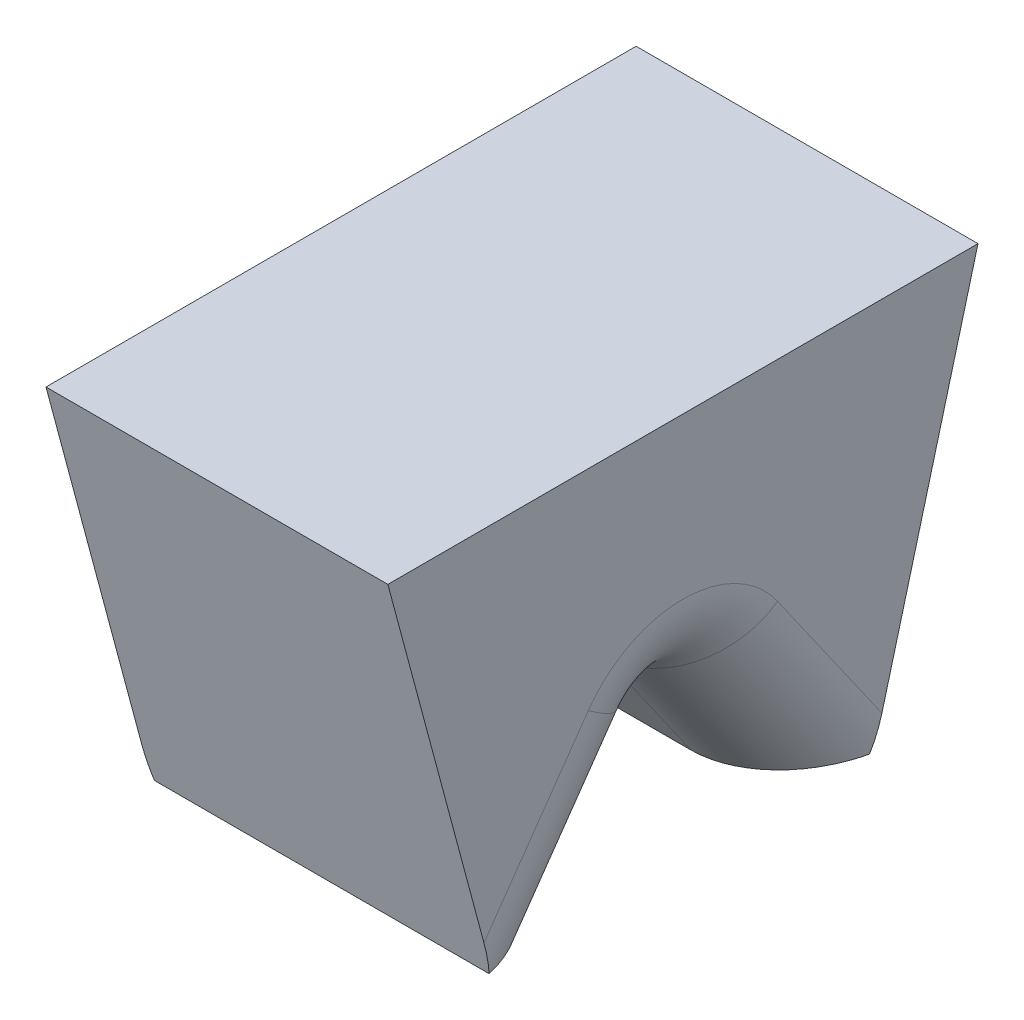
ISO-10303-21;
HEADER;
FILE_DESCRIPTION(('STEP AP214'),'2;1');
FILE_NAME('part.step','',(''),(''),'','','');
FILE_SCHEMA(('AUTOMOTIVE_DESIGN { 1 0 10303 214 1 1 1 1 }'));
ENDSEC;
DATA;
#1=APPLICATION_CONTEXT('core data for automotive mechanical design processes');
#2=APPLICATION_PROTOCOL_DEFINITION('international standard','automotive_design',2000,#1);
#3=PRODUCT_CONTEXT('',#1,'mechanical');
#4=PRODUCT('Part','Part','',(#3));
#5=PRODUCT_RELATED_PRODUCT_CATEGORY('part','',(#4));
#6=PRODUCT_DEFINITION_FORMATION('','',#4);
#7=PRODUCT_DEFINITION_CONTEXT('part definition',#1,'design');
#8=PRODUCT_DEFINITION('design','',#6,#7);
#9=PRODUCT_DEFINITION_SHAPE('','',#8);
#10=(LENGTH_UNIT() NAMED_UNIT(*) SI_UNIT(.MILLI.,.METRE.));
#11=(NAMED_UNIT(*) PLANE_ANGLE_UNIT() SI_UNIT($,.RADIAN.));
#12=(NAMED_UNIT(*) SI_UNIT($,.STERADIAN.) SOLID_ANGLE_UNIT());
#13=UNCERTAINTY_MEASURE_WITH_UNIT(LENGTH_MEASURE(1.E-05),#10,'distance_accuracy_value','');
#14=(GEOMETRIC_REPRESENTATION_CONTEXT(3) GLOBAL_UNCERTAINTY_ASSIGNED_CONTEXT((#13)) GLOBAL_UNIT_ASSIGNED_CONTEXT((#10,
#11,#12)) REPRESENTATION_CONTEXT('',''));
#15=CARTESIAN_POINT('',(0.,0.,0.));
#16=DIRECTION('',(0.,0.,1.));
#17=DIRECTION('',(1.,0.,0.));
#18=AXIS2_PLACEMENT_3D('',#15,#16,#17);
#19=CARTESIAN_POINT('',(0.,0.20650406504065,0.));
#20=DIRECTION('',(0.,1.,0.));
#21=DIRECTION('',(0.,0.,1.));
#22=AXIS2_PLACEMENT_3D('',#19,#20,#21);
#23=PLANE('',#22);
#24=DIRECTION('',(0.,0.,-1.));
#25=VECTOR('',#24,1.);
#26=CARTESIAN_POINT('',(-0.0914400000000001,0.20650406504065,1.50859998));
#27=LINE('',#26,#25);
#28=CARTESIAN_POINT('',(-0.0914399999999997,0.20650406504065,0.155662597461386));
#29=VERTEX_POINT('',#28);
#30=CARTESIAN_POINT('',(-0.0914399999999997,0.20650406504065,-0.155662597461386));
#31=VERTEX_POINT('',#30);
#32=EDGE_CURVE('E142',#29,#31,#27,.T.);
#33=ORIENTED_EDGE('',*,*,#32,.F.);
#34=DIRECTION('',(-1.,0.,0.));
#35=VECTOR('',#34,1.);
#36=CARTESIAN_POINT('',(1.50859998,0.20650406504065,0.155662597461386));
#37=LINE('',#36,#35);
#38=CARTESIAN_POINT('',(0.0888999999999999,0.20650406504065,0.155662597461386));
#39=VERTEX_POINT('',#38);
#40=EDGE_CURVE('E57',#39,#29,#37,.T.);
#41=ORIENTED_EDGE('',*,*,#40,.F.);
#42=DIRECTION('',(0.,0.,1.));
#43=VECTOR('',#42,1.);
#44=CARTESIAN_POINT('',(0.0888999999999999,0.20650406504065,1.50859998));
#45=LINE('',#44,#43);
#46=CARTESIAN_POINT('',(0.0888999999999999,0.20650406504065,-0.155662597461386));
#47=VERTEX_POINT('',#46);
#48=EDGE_CURVE('E12',#47,#39,#45,.T.);
#49=ORIENTED_EDGE('',*,*,#48,.F.);
#50=DIRECTION('',(1.,0.,0.));
#51=VECTOR('',#50,1.);
#52=CARTESIAN_POINT('',(1.50859998,0.20650406504065,-0.155662597461386));
#53=LINE('',#52,#51);
#54=EDGE_CURVE('E129',#31,#47,#53,.T.);
#55=ORIENTED_EDGE('',*,*,#54,.F.);
#56=EDGE_LOOP('',(#33,#41,#49,#55));
#57=FACE_BOUND('',#56,.T.);
#58=ADVANCED_FACE('F42',(#57),#23,.T.);
#59=CARTESIAN_POINT('',(1.50859998,0.,-0.10033));
#60=DIRECTION('',(0.,-0.258819045102522,-0.965925826289068));
#61=DIRECTION('',(0.,0.965925826289068,-0.258819045102522));
#62=AXIS2_PLACEMENT_3D('',#59,#60,#61);
#63=PLANE('',#62);
#64=DIRECTION('',(0.,0.965925826289068,-0.258819045102522));
#65=VECTOR('',#64,1.);
#66=CARTESIAN_POINT('',(-0.0914400000000001,0.,-0.10033));
#67=LINE('',#66,#65);
#68=CARTESIAN_POINT('',(-0.0914400000000001,0.0173247470469576,-0.104972151980306));
#69=VERTEX_POINT('',#68);
#70=EDGE_CURVE('E141',#69,#31,#67,.T.);
#71=ORIENTED_EDGE('',*,*,#70,.T.);
#72=ORIENTED_EDGE('',*,*,#54,.T.);
#73=DIRECTION('',(0.,-0.965925826289068,0.258819045102522));
#74=VECTOR('',#73,1.);
#75=CARTESIAN_POINT('',(0.0888999999999998,0.,-0.10033));
#76=LINE('',#75,#74);
#77=CARTESIAN_POINT('',(0.0888999999999998,0.0173247470469576,-0.104972151980306));
#78=VERTEX_POINT('',#77);
#79=EDGE_CURVE('E138',#47,#78,#76,.T.);
#80=ORIENTED_EDGE('',*,*,#79,.T.);
#81=CARTESIAN_POINT('',(0.0380999999999999,0.0173247470469576,-0.104972151980306));
#82=DIRECTION('',(0.,-0.258819045102522,-0.965925826289068));
#83=DIRECTION('',(0.,-0.965925826289068,0.258819045102522));
#84=AXIS2_PLACEMENT_3D('',#81,#82,#83);
#85=ELLIPSE('',#84,0.0663146902980799,0.0508);
#86=CARTESIAN_POINT('',(0.0870066537651457,0.,-0.10033));
#87=VERTEX_POINT('',#86);
#88=EDGE_CURVE('E205',#78,#87,#85,.T.);
#89=ORIENTED_EDGE('',*,*,#88,.T.);
#90=DIRECTION('',(-1.,0.,0.));
#91=VECTOR('',#90,1.);
#92=CARTESIAN_POINT('',(1.50859998,0.,-0.10033));
#93=LINE('',#92,#91);
#94=CARTESIAN_POINT('',(-0.0895466537651458,0.,-0.10033));
#95=VERTEX_POINT('',#94);
#96=EDGE_CURVE('E157',#87,#95,#93,.T.);
#97=ORIENTED_EDGE('',*,*,#96,.T.);
#98=CARTESIAN_POINT('',(-0.04064,0.0173247470469576,-0.104972151980306));
#99=DIRECTION('',(0.,-0.258819045102522,-0.965925826289068));
#100=DIRECTION('',(0.,0.965925826289068,-0.258819045102522));
#101=AXIS2_PLACEMENT_3D('',#98,#99,#100);
#102=ELLIPSE('',#101,0.0663146902980799,0.0508);
#103=EDGE_CURVE('E188',#95,#69,#102,.T.);
#104=ORIENTED_EDGE('',*,*,#103,.T.);
#105=EDGE_LOOP('',(#71,#72,#80,#89,#97,#104));
#106=FACE_BOUND('',#105,.T.);
#107=ADVANCED_FACE('F137',(#106),#63,.T.);
#108=CARTESIAN_POINT('',(1.50859998,0.,0.10033));
#109=DIRECTION('',(0.,-0.258819045102522,0.965925826289068));
#110=DIRECTION('',(0.,-0.965925826289068,-0.258819045102522));
#111=AXIS2_PLACEMENT_3D('',#108,#109,#110);
#112=PLANE('',#111);
#113=DIRECTION('',(0.,0.965925826289068,0.258819045102522));
#114=VECTOR('',#113,1.);
#115=CARTESIAN_POINT('',(0.0888999999999998,0.,0.10033));
#116=LINE('',#115,#114);
#117=CARTESIAN_POINT('',(0.0888999999999998,0.0173247470469576,0.104972151980306));
#118=VERTEX_POINT('',#117);
#119=EDGE_CURVE('E148',#118,#39,#116,.T.);
#120=ORIENTED_EDGE('',*,*,#119,.T.);
#121=ORIENTED_EDGE('',*,*,#40,.T.);
#122=DIRECTION('',(0.,-0.965925826289068,-0.258819045102522));
#123=VECTOR('',#122,1.);
#124=CARTESIAN_POINT('',(-0.0914400000000001,0.,0.10033));
#125=LINE('',#124,#123);
#126=CARTESIAN_POINT('',(-0.0914400000000001,0.0173247470469576,0.104972151980306));
#127=VERTEX_POINT('',#126);
#128=EDGE_CURVE('E159',#29,#127,#125,.T.);
#129=ORIENTED_EDGE('',*,*,#128,.T.);
#130=CARTESIAN_POINT('',(-0.04064,0.0173247470469576,0.104972151980306));
#131=DIRECTION('',(0.,-0.258819045102522,0.965925826289068));
#132=DIRECTION('',(0.,-0.965925826289068,-0.258819045102522));
#133=AXIS2_PLACEMENT_3D('',#130,#131,#132);
#134=ELLIPSE('',#133,0.0663146902980799,0.0508);
#135=CARTESIAN_POINT('',(-0.0895466537651458,0.,0.10033));
#136=VERTEX_POINT('',#135);
#137=EDGE_CURVE('E175',#127,#136,#134,.T.);
#138=ORIENTED_EDGE('',*,*,#137,.T.);
#139=DIRECTION('',(-1.,0.,0.));
#140=VECTOR('',#139,1.);
#141=CARTESIAN_POINT('',(1.50859998,0.,0.10033));
#142=LINE('',#141,#140);
#143=CARTESIAN_POINT('',(0.0870066537651457,0.,0.10033));
#144=VERTEX_POINT('',#143);
#145=EDGE_CURVE('E150',#144,#136,#142,.T.);
#146=ORIENTED_EDGE('',*,*,#145,.F.);
#147=CARTESIAN_POINT('',(0.0380999999999999,0.0173247470469576,0.104972151980306));
#148=DIRECTION('',(0.,-0.258819045102522,0.965925826289068));
#149=DIRECTION('',(0.,0.965925826289068,0.258819045102522));
#150=AXIS2_PLACEMENT_3D('',#147,#148,#149);
#151=ELLIPSE('',#150,0.0663146902980799,0.0508);
#152=EDGE_CURVE('E212',#144,#118,#151,.T.);
#153=ORIENTED_EDGE('',*,*,#152,.T.);
#154=EDGE_LOOP('',(#120,#121,#129,#138,#146,#153));
#155=FACE_BOUND('',#154,.T.);
#156=ADVANCED_FACE('F250',(#155),#112,.T.);
#157=CARTESIAN_POINT('',(-0.0914400000000001,0.39640002,1.50859998));
#158=DIRECTION('',(-1.,0.,0.));
#159=DIRECTION('',(0.,-1.,0.));
#160=AXIS2_PLACEMENT_3D('',#157,#158,#159);
#161=PLANE('',#160);
#162=ORIENTED_EDGE('',*,*,#128,.F.);
#163=ORIENTED_EDGE('',*,*,#32,.T.);
#164=ORIENTED_EDGE('',*,*,#70,.F.);
#165=DIRECTION('',(0.,-0.819152044288994,-0.573576436351043));
#166=VECTOR('',#165,1.);
#167=CARTESIAN_POINT('',(-0.09144,0.0959252195599596,-0.0499355086198571));
#168=LINE('',#167,#166);
#169=CARTESIAN_POINT('',(-0.09144,0.0959252195599598,-0.049935508619857));
#170=VERTEX_POINT('',#169);
#171=EDGE_CURVE('E168',#69,#170,#168,.F.);
#172=ORIENTED_EDGE('',*,*,#171,.T.);
#173=CARTESIAN_POINT('',(-0.09144,0.0609599999999999,0.));
#174=DIRECTION('',(-1.,0.,0.));
#175=DIRECTION('',(0.,-1.,0.));
#176=AXIS2_PLACEMENT_3D('',#173,#174,#175);
#177=CIRCLE('',#176,0.0609600000000001);
#178=CARTESIAN_POINT('',(-0.09144,0.0959252195599596,0.0499355086198571));
#179=VERTEX_POINT('',#178);
#180=EDGE_CURVE('E170',#170,#179,#177,.F.);
#181=ORIENTED_EDGE('',*,*,#180,.T.);
#182=DIRECTION('',(0.,0.819152044288994,-0.573576436351043));
#183=VECTOR('',#182,1.);
#184=CARTESIAN_POINT('',(-0.09144,0.029137682966633,0.0967006452009609));
#185=LINE('',#184,#183);
#186=EDGE_CURVE('E172',#179,#127,#185,.F.);
#187=ORIENTED_EDGE('',*,*,#186,.T.);
#188=EDGE_LOOP('',(#162,#163,#164,#172,#181,#187));
#189=FACE_BOUND('',#188,.T.);
#190=ADVANCED_FACE('F252',(#189),#161,.T.);
#191=CARTESIAN_POINT('',(0.0888999999999999,-0.00999998,1.50859998));
#192=DIRECTION('',(1.,0.,0.));
#193=DIRECTION('',(0.,1.,0.));
#194=AXIS2_PLACEMENT_3D('',#191,#192,#193);
#195=PLANE('',#194);
#196=ORIENTED_EDGE('',*,*,#79,.F.);
#197=ORIENTED_EDGE('',*,*,#48,.T.);
#198=ORIENTED_EDGE('',*,*,#119,.F.);
#199=DIRECTION('',(0.,-0.819152044288994,0.573576436351043));
#200=VECTOR('',#199,1.);
#201=CARTESIAN_POINT('',(0.0888999999999999,0.0959252195599596,0.0499355086198571));
#202=LINE('',#201,#200);
#203=CARTESIAN_POINT('',(0.0888999999999999,0.0959252195599596,0.0499355086198571));
#204=VERTEX_POINT('',#203);
#205=EDGE_CURVE('E202',#118,#204,#202,.F.);
#206=ORIENTED_EDGE('',*,*,#205,.T.);
#207=CARTESIAN_POINT('',(0.0888999999999999,0.0609599999999999,0.));
#208=DIRECTION('',(1.,0.,0.));
#209=DIRECTION('',(0.,1.,0.));
#210=AXIS2_PLACEMENT_3D('',#207,#208,#209);
#211=CIRCLE('',#210,0.0609600000000001);
#212=CARTESIAN_POINT('',(0.0888999999999999,0.0959252195599596,-0.0499355086198571));
#213=VERTEX_POINT('',#212);
#214=EDGE_CURVE('E200',#204,#213,#211,.F.);
#215=ORIENTED_EDGE('',*,*,#214,.T.);
#216=DIRECTION('',(0.,0.819152044288994,0.573576436351043));
#217=VECTOR('',#216,1.);
#218=CARTESIAN_POINT('',(0.0888999999999999,0.029137682966633,-0.0967006452009609));
#219=LINE('',#218,#217);
#220=EDGE_CURVE('E146',#213,#78,#219,.F.);
#221=ORIENTED_EDGE('',*,*,#220,.T.);
#222=EDGE_LOOP('',(#196,#197,#198,#206,#215,#221));
#223=FACE_BOUND('',#222,.T.);
#224=ADVANCED_FACE('F144',(#223),#195,.T.);
#225=CARTESIAN_POINT('',(0.,0.,0.));
#226=DIRECTION('',(0.,1.,0.));
#227=DIRECTION('',(0.,0.,1.));
#228=AXIS2_PLACEMENT_3D('',#225,#226,#227);
#229=PLANE('',#228);
#230=ORIENTED_EDGE('',*,*,#96,.F.);
#231=CARTESIAN_POINT('',(0.0380999999999999,0.,-0.117103070460162));
#232=DIRECTION('',(0.,1.,0.));
#233=DIRECTION('',(0.,0.,-1.));
#234=AXIS2_PLACEMENT_3D('',#231,#232,#233);
#235=ELLIPSE('',#234,0.0620153491090818,0.0508);
#236=CARTESIAN_POINT('',(0.0380999999999999,0.,-0.05508772135108));
#237=VERTEX_POINT('',#236);
#238=EDGE_CURVE('E207',#87,#237,#235,.F.);
#239=ORIENTED_EDGE('',*,*,#238,.T.);
#240=DIRECTION('',(-1.,0.,0.));
#241=VECTOR('',#240,1.);
#242=CARTESIAN_POINT('',(0.,0.,-0.05508772135108));
#243=LINE('',#242,#241);
#244=CARTESIAN_POINT('',(-0.04064,0.,-0.05508772135108));
#245=VERTEX_POINT('',#244);
#246=EDGE_CURVE('E163',#237,#245,#243,.T.);
#247=ORIENTED_EDGE('',*,*,#246,.T.);
#248=CARTESIAN_POINT('',(-0.04064,0.,-0.117103070460162));
#249=DIRECTION('',(0.,1.,0.));
#250=DIRECTION('',(0.,0.,1.));
#251=AXIS2_PLACEMENT_3D('',#248,#249,#250);
#252=ELLIPSE('',#251,0.0620153491090818,0.0508);
#253=EDGE_CURVE('E185',#245,#95,#252,.F.);
#254=ORIENTED_EDGE('',*,*,#253,.T.);
#255=EDGE_LOOP('',(#230,#239,#247,#254));
#256=FACE_BOUND('',#255,.T.);
#257=ADVANCED_FACE('F272',(#256),#229,.F.);
#258=DIRECTION('',(1.,0.,0.));
#259=VECTOR('',#258,1.);
#260=CARTESIAN_POINT('',(0.,0.,0.05508772135108));
#261=LINE('',#260,#259);
#262=CARTESIAN_POINT('',(-0.04064,0.,0.05508772135108));
#263=VERTEX_POINT('',#262);
#264=CARTESIAN_POINT('',(0.0380999999999999,0.,0.05508772135108));
#265=VERTEX_POINT('',#264);
#266=EDGE_CURVE('E161',#263,#265,#261,.T.);
#267=ORIENTED_EDGE('',*,*,#266,.T.);
#268=CARTESIAN_POINT('',(0.0380999999999999,0.,0.117103070460162));
#269=DIRECTION('',(0.,1.,0.));
#270=DIRECTION('',(0.,0.,-1.));
#271=AXIS2_PLACEMENT_3D('',#268,#269,#270);
#272=ELLIPSE('',#271,0.0620153491090818,0.0508);
#273=EDGE_CURVE('E64',#265,#144,#272,.F.);
#274=ORIENTED_EDGE('',*,*,#273,.T.);
#275=ORIENTED_EDGE('',*,*,#145,.T.);
#276=CARTESIAN_POINT('',(-0.04064,0.,0.117103070460162));
#277=DIRECTION('',(0.,1.,0.));
#278=DIRECTION('',(0.,0.,1.));
#279=AXIS2_PLACEMENT_3D('',#276,#277,#278);
#280=ELLIPSE('',#279,0.0620153491090818,0.0508);
#281=EDGE_CURVE('E178',#136,#263,#280,.F.);
#282=ORIENTED_EDGE('',*,*,#281,.T.);
#283=EDGE_LOOP('',(#267,#274,#275,#282));
#284=FACE_BOUND('',#283,.T.);
#285=ADVANCED_FACE('F233',(#284),#229,.F.);
#286=CARTESIAN_POINT('',(-1.20142,0.0667875365933266,-0.00832258476997621));
#287=DIRECTION('',(0.,0.573576436351043,-0.819152044288994));
#288=DIRECTION('',(0.,0.819152044288994,0.573576436351043));
#289=AXIS2_PLACEMENT_3D('',#286,#287,#288);
#290=PLANE('',#289);
#291=ORIENTED_EDGE('',*,*,#246,.F.);
#292=DIRECTION('',(0.,0.819152044288994,0.573576436351043));
#293=VECTOR('',#292,1.);
#294=CARTESIAN_POINT('',(0.0380999999999999,0.0667875365933266,-0.00832258476997621));
#295=LINE('',#294,#293);
#296=CARTESIAN_POINT('',(0.0380999999999999,0.0667875365933266,-0.00832258476997621));
#297=VERTEX_POINT('',#296);
#298=EDGE_CURVE('E190',#237,#297,#295,.T.);
#299=ORIENTED_EDGE('',*,*,#298,.T.);
#300=DIRECTION('',(1.,0.,0.));
#301=VECTOR('',#300,1.);
#302=CARTESIAN_POINT('',(-1.20142,0.0667875365933266,-0.00832258476997621));
#303=LINE('',#302,#301);
#304=CARTESIAN_POINT('',(-0.04064,0.0667875365933266,-0.00832258476997621));
#305=VERTEX_POINT('',#304);
#306=EDGE_CURVE('E197',#305,#297,#303,.T.);
#307=ORIENTED_EDGE('',*,*,#306,.F.);
#308=DIRECTION('',(0.,-0.819152044288994,-0.573576436351043));
#309=VECTOR('',#308,1.);
#310=CARTESIAN_POINT('',(-0.04064,0.,-0.05508772135108));
#311=LINE('',#310,#309);
#312=EDGE_CURVE('E182',#305,#245,#311,.T.);
#313=ORIENTED_EDGE('',*,*,#312,.T.);
#314=EDGE_LOOP('',(#291,#299,#307,#313));
#315=FACE_BOUND('',#314,.T.);
#316=ADVANCED_FACE('F265',(#315),#290,.F.);
#317=CARTESIAN_POINT('',(-1.20142,0.0609599999999999,0.));
#318=DIRECTION('',(1.,0.,0.));
#319=DIRECTION('',(0.,0.,-1.));
#320=AXIS2_PLACEMENT_3D('',#317,#318,#319);
#321=CYLINDRICAL_SURFACE('',#320,0.0101600000000001);
#322=ORIENTED_EDGE('',*,*,#306,.T.);
#323=CARTESIAN_POINT('',(0.0380999999999999,0.0609599999999999,0.));
#324=DIRECTION('',(1.,0.,0.));
#325=DIRECTION('',(0.,1.,0.));
#326=AXIS2_PLACEMENT_3D('',#323,#324,#325);
#327=CIRCLE('',#326,0.0101600000000001);
#328=CARTESIAN_POINT('',(0.0380999999999999,0.0667875365933266,0.00832258476997621));
#329=VERTEX_POINT('',#328);
#330=EDGE_CURVE('E50',#297,#329,#327,.T.);
#331=ORIENTED_EDGE('',*,*,#330,.T.);
#332=DIRECTION('',(1.,0.,0.));
#333=VECTOR('',#332,1.);
#334=CARTESIAN_POINT('',(-1.20142,0.0667875365933266,0.00832258476997621));
#335=LINE('',#334,#333);
#336=CARTESIAN_POINT('',(-0.04064,0.0667875365933266,0.00832258476997621));
#337=VERTEX_POINT('',#336);
#338=EDGE_CURVE('E152',#337,#329,#335,.T.);
#339=ORIENTED_EDGE('',*,*,#338,.F.);
#340=CARTESIAN_POINT('',(-0.04064,0.0609599999999999,0.));
#341=DIRECTION('',(-1.,0.,0.));
#342=DIRECTION('',(0.,-1.,0.));
#343=AXIS2_PLACEMENT_3D('',#340,#341,#342);
#344=CIRCLE('',#343,0.0101600000000001);
#345=EDGE_CURVE('E180',#337,#305,#344,.T.);
#346=ORIENTED_EDGE('',*,*,#345,.T.);
#347=EDGE_LOOP('',(#322,#331,#339,#346));
#348=FACE_BOUND('',#347,.T.);
#349=ADVANCED_FACE('F243',(#348),#321,.F.);
#350=CARTESIAN_POINT('',(-1.20142,-0.00999998000000012,0.0620897827290263));
#351=DIRECTION('',(0.,0.573576436351043,0.819152044288994));
#352=DIRECTION('',(0.,-0.819152044288994,0.573576436351043));
#353=AXIS2_PLACEMENT_3D('',#350,#351,#352);
#354=PLANE('',#353);
#355=ORIENTED_EDGE('',*,*,#338,.T.);
#356=DIRECTION('',(0.,-0.819152044288994,0.573576436351043));
#357=VECTOR('',#356,1.);
#358=CARTESIAN_POINT('',(0.0380999999999999,0.,0.05508772135108));
#359=LINE('',#358,#357);
#360=EDGE_CURVE('E209',#329,#265,#359,.T.);
#361=ORIENTED_EDGE('',*,*,#360,.T.);
#362=ORIENTED_EDGE('',*,*,#266,.F.);
#363=DIRECTION('',(0.,0.819152044288994,-0.573576436351043));
#364=VECTOR('',#363,1.);
#365=CARTESIAN_POINT('',(-0.04064,0.0667875365933266,0.0083225847699762));
#366=LINE('',#365,#364);
#367=EDGE_CURVE('E165',#263,#337,#366,.T.);
#368=ORIENTED_EDGE('',*,*,#367,.T.);
#369=EDGE_LOOP('',(#355,#361,#362,#368));
#370=FACE_BOUND('',#369,.T.);
#371=ADVANCED_FACE('F230',(#370),#354,.F.);
#372=CARTESIAN_POINT('',(-0.04064,0.0959252195599597,-0.049935508619857));
#373=DIRECTION('',(0.,0.819152044288994,0.573576436351043));
#374=DIRECTION('',(0.,-0.573576436351043,0.819152044288994));
#375=AXIS2_PLACEMENT_3D('',#372,#373,#374);
#376=CYLINDRICAL_SURFACE('',#375,0.0508);
#377=ORIENTED_EDGE('',*,*,#253,.F.);
#378=ORIENTED_EDGE('',*,*,#312,.F.);
#379=CARTESIAN_POINT('',(-0.04064,0.0959252195599598,-0.049935508619857));
#380=DIRECTION('',(0.,0.819152044288991,0.573576436351046));
#381=DIRECTION('',(0.,-0.573576436351046,0.819152044288992));
#382=AXIS2_PLACEMENT_3D('',#379,#380,#381);
#383=CIRCLE('',#382,0.0508);
#384=EDGE_CURVE('E193',#170,#305,#383,.T.);
#385=ORIENTED_EDGE('',*,*,#384,.F.);
#386=ORIENTED_EDGE('',*,*,#171,.F.);
#387=ORIENTED_EDGE('',*,*,#103,.F.);
#388=EDGE_LOOP('',(#377,#378,#385,#386,#387));
#389=FACE_BOUND('',#388,.T.);
#390=ADVANCED_FACE('F261',(#389),#376,.T.);
#391=CARTESIAN_POINT('',(-0.04064,0.0609599999999999,0.));
#392=DIRECTION('',(-1.,0.,0.));
#393=DIRECTION('',(0.,-1.,0.));
#394=AXIS2_PLACEMENT_3D('',#391,#392,#393);
#395=TOROIDAL_SURFACE('',#394,0.0609600000000001,0.0508);
#396=ORIENTED_EDGE('',*,*,#384,.T.);
#397=ORIENTED_EDGE('',*,*,#345,.F.);
#398=CARTESIAN_POINT('',(-0.04064,0.0959252195599596,0.0499355086198571));
#399=DIRECTION('',(0.,-0.819152044288994,0.573576436351043));
#400=DIRECTION('',(0.,-0.573576436351043,-0.819152044288994));
#401=AXIS2_PLACEMENT_3D('',#398,#399,#400);
#402=CIRCLE('',#401,0.0508);
#403=EDGE_CURVE('E191',#179,#337,#402,.T.);
#404=ORIENTED_EDGE('',*,*,#403,.F.);
#405=ORIENTED_EDGE('',*,*,#180,.F.);
#406=EDGE_LOOP('',(#396,#397,#404,#405));
#407=FACE_BOUND('',#406,.T.);
#408=ADVANCED_FACE('F255',(#407),#395,.T.);
#409=CARTESIAN_POINT('',(-0.04064,0.019137702966633,0.103702706578907));
#410=DIRECTION('',(0.,-0.819152044288994,0.573576436351043));
#411=DIRECTION('',(0.,-0.573576436351043,-0.819152044288994));
#412=AXIS2_PLACEMENT_3D('',#409,#410,#411);
#413=CYLINDRICAL_SURFACE('',#412,0.0508);
#414=ORIENTED_EDGE('',*,*,#137,.F.);
#415=ORIENTED_EDGE('',*,*,#186,.F.);
#416=ORIENTED_EDGE('',*,*,#403,.T.);
#417=ORIENTED_EDGE('',*,*,#367,.F.);
#418=ORIENTED_EDGE('',*,*,#281,.F.);
#419=EDGE_LOOP('',(#414,#415,#416,#417,#418));
#420=FACE_BOUND('',#419,.T.);
#421=ADVANCED_FACE('F237',(#420),#413,.T.);
#422=CARTESIAN_POINT('',(0.0380999999999999,0.0191377029666329,0.103702706578907));
#423=DIRECTION('',(0.,0.819152044288994,-0.573576436351043));
#424=DIRECTION('',(0.,0.573576436351043,0.819152044288994));
#425=AXIS2_PLACEMENT_3D('',#422,#423,#424);
#426=CYLINDRICAL_SURFACE('',#425,0.0508);
#427=ORIENTED_EDGE('',*,*,#273,.F.);
#428=ORIENTED_EDGE('',*,*,#360,.F.);
#429=CARTESIAN_POINT('',(0.0380999999999999,0.0959252195599596,0.0499355086198571));
#430=DIRECTION('',(0.,0.819152044288994,-0.573576436351043));
#431=DIRECTION('',(0.,0.573576436351043,0.819152044288994));
#432=AXIS2_PLACEMENT_3D('',#429,#430,#431);
#433=CIRCLE('',#432,0.0508);
#434=EDGE_CURVE('E194',#204,#329,#433,.T.);
#435=ORIENTED_EDGE('',*,*,#434,.F.);
#436=ORIENTED_EDGE('',*,*,#205,.F.);
#437=ORIENTED_EDGE('',*,*,#152,.F.);
#438=EDGE_LOOP('',(#427,#428,#435,#436,#437));
#439=FACE_BOUND('',#438,.T.);
#440=ADVANCED_FACE('F44',(#439),#426,.T.);
#441=CARTESIAN_POINT('',(0.0380999999999999,0.0609599999999999,0.));
#442=DIRECTION('',(1.,0.,0.));
#443=DIRECTION('',(0.,1.,0.));
#444=AXIS2_PLACEMENT_3D('',#441,#442,#443);
#445=TOROIDAL_SURFACE('',#444,0.0609600000000001,0.0508);
#446=ORIENTED_EDGE('',*,*,#434,.T.);
#447=ORIENTED_EDGE('',*,*,#330,.F.);
#448=CARTESIAN_POINT('',(0.0380999999999999,0.0959252195599596,-0.0499355086198571));
#449=DIRECTION('',(0.,-0.819152044288994,-0.573576436351043));
#450=DIRECTION('',(0.,0.573576436351043,-0.819152044288994));
#451=AXIS2_PLACEMENT_3D('',#448,#449,#450);
#452=CIRCLE('',#451,0.0508);
#453=EDGE_CURVE('E215',#213,#297,#452,.T.);
#454=ORIENTED_EDGE('',*,*,#453,.F.);
#455=ORIENTED_EDGE('',*,*,#214,.F.);
#456=EDGE_LOOP('',(#446,#447,#454,#455));
#457=FACE_BOUND('',#456,.T.);
#458=ADVANCED_FACE('F221',(#457),#445,.T.);
#459=CARTESIAN_POINT('',(0.0380999999999999,0.0959252195599596,-0.0499355086198571));
#460=DIRECTION('',(0.,-0.819152044288994,-0.573576436351043));
#461=DIRECTION('',(0.,0.573576436351043,-0.819152044288994));
#462=AXIS2_PLACEMENT_3D('',#459,#460,#461);
#463=CYLINDRICAL_SURFACE('',#462,0.0508);
#464=ORIENTED_EDGE('',*,*,#88,.F.);
#465=ORIENTED_EDGE('',*,*,#220,.F.);
#466=ORIENTED_EDGE('',*,*,#453,.T.);
#467=ORIENTED_EDGE('',*,*,#298,.F.);
#468=ORIENTED_EDGE('',*,*,#238,.F.);
#469=EDGE_LOOP('',(#464,#465,#466,#467,#468));
#470=FACE_BOUND('',#469,.T.);
#471=ADVANCED_FACE('F269',(#470),#463,.T.);
#472=CLOSED_SHELL('',(#58,#107,#156,#190,#224,#257,#285,#316,#349,#371,#390,#408,#421,#440,#458,#471));
#473=MANIFOLD_SOLID_BREP('B2',#472);
#474=ADVANCED_BREP_SHAPE_REPRESENTATION('',(#18,#473),#14);
#475=SHAPE_DEFINITION_REPRESENTATION(#9,#474);
ENDSEC;
END-ISO-10303-21;
